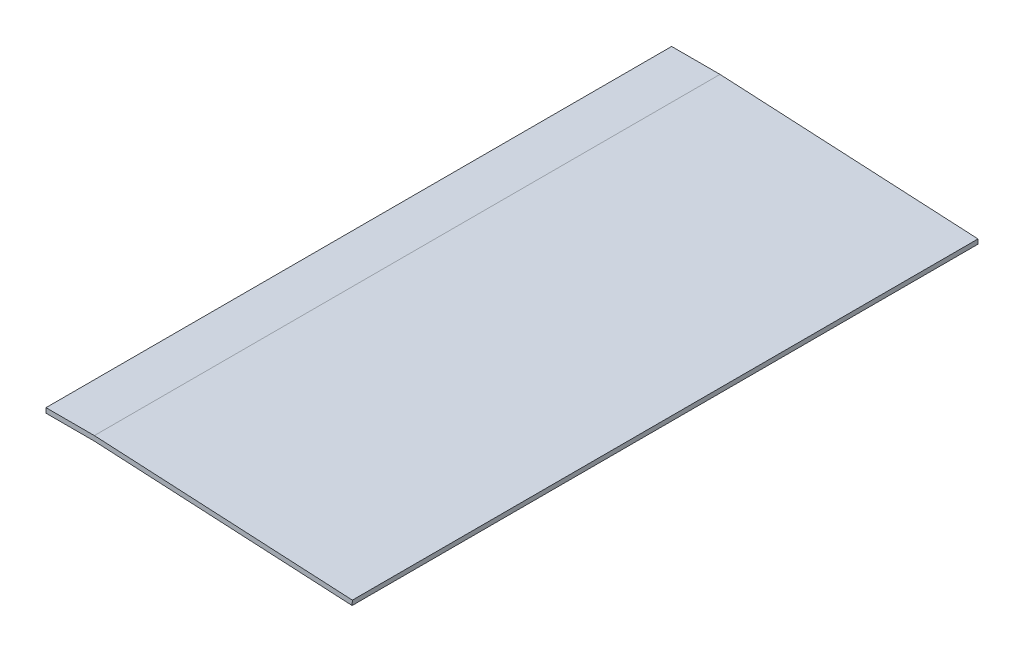
ISO-10303-21;
HEADER;
FILE_DESCRIPTION(('STEP AP214'),'2;1');
FILE_NAME('part.step','',(''),(''),'','','');
FILE_SCHEMA(('AUTOMOTIVE_DESIGN { 1 0 10303 214 1 1 1 1 }'));
ENDSEC;
DATA;
#1=APPLICATION_CONTEXT('core data for automotive mechanical design processes');
#2=APPLICATION_PROTOCOL_DEFINITION('international standard','automotive_design',2000,#1);
#3=PRODUCT_CONTEXT('',#1,'mechanical');
#4=PRODUCT('Part','Part','',(#3));
#5=PRODUCT_RELATED_PRODUCT_CATEGORY('part','',(#4));
#6=PRODUCT_DEFINITION_FORMATION('','',#4);
#7=PRODUCT_DEFINITION_CONTEXT('part definition',#1,'design');
#8=PRODUCT_DEFINITION('design','',#6,#7);
#9=PRODUCT_DEFINITION_SHAPE('','',#8);
#10=(LENGTH_UNIT() NAMED_UNIT(*) SI_UNIT(.MILLI.,.METRE.));
#11=(NAMED_UNIT(*) PLANE_ANGLE_UNIT() SI_UNIT($,.RADIAN.));
#12=(NAMED_UNIT(*) SI_UNIT($,.STERADIAN.) SOLID_ANGLE_UNIT());
#13=UNCERTAINTY_MEASURE_WITH_UNIT(LENGTH_MEASURE(1.E-05),#10,'distance_accuracy_value','');
#14=(GEOMETRIC_REPRESENTATION_CONTEXT(3) GLOBAL_UNCERTAINTY_ASSIGNED_CONTEXT((#13)) GLOBAL_UNIT_ASSIGNED_CONTEXT((#10,
#11,#12)) REPRESENTATION_CONTEXT('',''));
#15=CARTESIAN_POINT('',(0.,0.,0.));
#16=DIRECTION('',(0.,0.,1.));
#17=DIRECTION('',(1.,0.,0.));
#18=AXIS2_PLACEMENT_3D('',#15,#16,#17);
#19=CARTESIAN_POINT('',(0.,0.,388.));
#20=DIRECTION('',(0.,-1.,0.));
#21=DIRECTION('',(1.,0.,0.));
#22=AXIS2_PLACEMENT_3D('',#19,#20,#21);
#23=PLANE('',#22);
#24=DIRECTION('',(-1.,0.,0.));
#25=VECTOR('',#24,1.);
#26=CARTESIAN_POINT('',(0.,0.,0.));
#27=LINE('',#26,#25);
#28=CARTESIAN_POINT('',(30.,0.,0.));
#29=VERTEX_POINT('',#28);
#30=CARTESIAN_POINT('',(0.,0.,0.));
#31=VERTEX_POINT('',#30);
#32=EDGE_CURVE('E121',#29,#31,#27,.T.);
#33=ORIENTED_EDGE('',*,*,#32,.F.);
#34=DIRECTION('',(0.,0.,-1.));
#35=VECTOR('',#34,1.);
#36=CARTESIAN_POINT('',(30.,0.,388.));
#37=LINE('',#36,#35);
#38=CARTESIAN_POINT('',(30.,0.,388.));
#39=VERTEX_POINT('',#38);
#40=EDGE_CURVE('E11',#39,#29,#37,.T.);
#41=ORIENTED_EDGE('',*,*,#40,.F.);
#42=DIRECTION('',(-1.,0.,0.));
#43=VECTOR('',#42,1.);
#44=CARTESIAN_POINT('',(0.,0.,388.));
#45=LINE('',#44,#43);
#46=CARTESIAN_POINT('',(0.,0.,388.));
#47=VERTEX_POINT('',#46);
#48=EDGE_CURVE('E133',#39,#47,#45,.T.);
#49=ORIENTED_EDGE('',*,*,#48,.T.);
#50=DIRECTION('',(0.,0.,-1.));
#51=VECTOR('',#50,1.);
#52=CARTESIAN_POINT('',(0.,0.,388.));
#53=LINE('',#52,#51);
#54=EDGE_CURVE('E55',#47,#31,#53,.T.);
#55=ORIENTED_EDGE('',*,*,#54,.T.);
#56=EDGE_LOOP('',(#33,#41,#49,#55));
#57=FACE_BOUND('',#56,.T.);
#58=ADVANCED_FACE('F39',(#57),#23,.T.);
#59=CARTESIAN_POINT('',(0.0821715694758779,1.56792694901459,388.));
#60=DIRECTION('',(0.0523359562429368,0.998629534754574,0.));
#61=DIRECTION('',(-0.998629534754574,0.0523359562429368,0.));
#62=AXIS2_PLACEMENT_3D('',#59,#60,#61);
#63=PLANE('',#62);
#64=DIRECTION('',(0.998629534754574,-0.0523359562429368,0.));
#65=VECTOR('',#64,1.);
#66=CARTESIAN_POINT('',(0.0821715694758779,1.56792694901459,0.));
#67=LINE('',#66,#65);
#68=CARTESIAN_POINT('',(189.842992131271,-8.37701625155542,0.));
#69=VERTEX_POINT('',#68);
#70=EDGE_CURVE('E123',#29,#69,#67,.T.);
#71=ORIENTED_EDGE('',*,*,#70,.T.);
#72=DIRECTION('',(0.,0.,-1.));
#73=VECTOR('',#72,1.);
#74=CARTESIAN_POINT('',(189.842992131271,-8.37701625155542,388.));
#75=LINE('',#74,#73);
#76=CARTESIAN_POINT('',(189.842992131271,-8.37701625155542,388.));
#77=VERTEX_POINT('',#76);
#78=EDGE_CURVE('E47',#77,#69,#75,.T.);
#79=ORIENTED_EDGE('',*,*,#78,.F.);
#80=DIRECTION('',(0.998629534754574,-0.0523359562429368,0.));
#81=VECTOR('',#80,1.);
#82=CARTESIAN_POINT('',(0.0821715694758779,1.56792694901459,388.));
#83=LINE('',#82,#81);
#84=EDGE_CURVE('E231',#39,#77,#83,.T.);
#85=ORIENTED_EDGE('',*,*,#84,.F.);
#86=ORIENTED_EDGE('',*,*,#40,.T.);
#87=EDGE_LOOP('',(#71,#79,#85,#86));
#88=FACE_BOUND('',#87,.T.);
#89=ADVANCED_FACE('F156',(#88),#63,.F.);
#90=CARTESIAN_POINT('',(189.760820561795,-9.94494320057098,388.));
#91=DIRECTION('',(-0.998629534754574,0.0523359562429419,0.));
#92=DIRECTION('',(-0.0523359562429419,-0.998629534754574,0.));
#93=AXIS2_PLACEMENT_3D('',#90,#91,#92);
#94=PLANE('',#93);
#95=DIRECTION('',(0.0523359562429419,0.998629534754574,0.));
#96=VECTOR('',#95,1.);
#97=CARTESIAN_POINT('',(189.760820561795,-9.94494320057098,0.));
#98=LINE('',#97,#96);
#99=CARTESIAN_POINT('',(190.,-5.3811276472917,0.));
#100=VERTEX_POINT('',#99);
#101=EDGE_CURVE('E125',#69,#100,#98,.T.);
#102=ORIENTED_EDGE('',*,*,#101,.T.);
#103=DIRECTION('',(0.,0.,-1.));
#104=VECTOR('',#103,1.);
#105=CARTESIAN_POINT('',(190.,-5.3811276472917,388.));
#106=LINE('',#105,#104);
#107=CARTESIAN_POINT('',(190.,-5.3811276472917,388.));
#108=VERTEX_POINT('',#107);
#109=EDGE_CURVE('E113',#108,#100,#106,.T.);
#110=ORIENTED_EDGE('',*,*,#109,.F.);
#111=DIRECTION('',(0.0523359562429419,0.998629534754574,0.));
#112=VECTOR('',#111,1.);
#113=CARTESIAN_POINT('',(189.760820561795,-9.94494320057098,388.));
#114=LINE('',#113,#112);
#115=EDGE_CURVE('E101',#77,#108,#114,.T.);
#116=ORIENTED_EDGE('',*,*,#115,.F.);
#117=ORIENTED_EDGE('',*,*,#78,.T.);
#118=EDGE_LOOP('',(#102,#110,#116,#117));
#119=FACE_BOUND('',#118,.T.);
#120=ADVANCED_FACE('F140',(#119),#94,.F.);
#121=CARTESIAN_POINT('',(0.238807253133945,4.5589522209196,388.));
#122=DIRECTION('',(-0.0523103303511996,-0.998630877420956,0.));
#123=DIRECTION('',(0.998630877420956,-0.0523103303511996,0.));
#124=AXIS2_PLACEMENT_3D('',#121,#122,#123);
#125=PLANE('',#124);
#126=DIRECTION('',(-0.998630877420956,0.0523103303511996,0.));
#127=VECTOR('',#126,1.);
#128=CARTESIAN_POINT('',(0.238807253133945,4.5589522209196,0.));
#129=LINE('',#128,#127);
#130=CARTESIAN_POINT('',(30.,3.,0.));
#131=VERTEX_POINT('',#130);
#132=EDGE_CURVE('E110',#100,#131,#129,.T.);
#133=ORIENTED_EDGE('',*,*,#132,.T.);
#134=DIRECTION('',(0.,0.,-1.));
#135=VECTOR('',#134,1.);
#136=CARTESIAN_POINT('',(30.,3.,388.));
#137=LINE('',#136,#135);
#138=CARTESIAN_POINT('',(30.,3.,388.));
#139=VERTEX_POINT('',#138);
#140=EDGE_CURVE('E107',#139,#131,#137,.T.);
#141=ORIENTED_EDGE('',*,*,#140,.F.);
#142=DIRECTION('',(-0.998630877420956,0.0523103303511996,0.));
#143=VECTOR('',#142,1.);
#144=CARTESIAN_POINT('',(0.238807253133945,4.5589522209196,388.));
#145=LINE('',#144,#143);
#146=EDGE_CURVE('E93',#108,#139,#145,.T.);
#147=ORIENTED_EDGE('',*,*,#146,.F.);
#148=ORIENTED_EDGE('',*,*,#109,.T.);
#149=EDGE_LOOP('',(#133,#141,#147,#148));
#150=FACE_BOUND('',#149,.T.);
#151=ADVANCED_FACE('F108',(#150),#125,.F.);
#152=CARTESIAN_POINT('',(0.,3.,388.));
#153=DIRECTION('',(0.,1.,0.));
#154=DIRECTION('',(0.,0.,1.));
#155=AXIS2_PLACEMENT_3D('',#152,#153,#154);
#156=PLANE('',#155);
#157=DIRECTION('',(1.,0.,0.));
#158=VECTOR('',#157,1.);
#159=CARTESIAN_POINT('',(0.,3.,0.));
#160=LINE('',#159,#158);
#161=CARTESIAN_POINT('',(0.,3.,0.));
#162=VERTEX_POINT('',#161);
#163=EDGE_CURVE('E128',#162,#131,#160,.T.);
#164=ORIENTED_EDGE('',*,*,#163,.F.);
#165=DIRECTION('',(0.,0.,-1.));
#166=VECTOR('',#165,1.);
#167=CARTESIAN_POINT('',(0.,3.,388.));
#168=LINE('',#167,#166);
#169=CARTESIAN_POINT('',(0.,3.,388.));
#170=VERTEX_POINT('',#169);
#171=EDGE_CURVE('E74',#170,#162,#168,.T.);
#172=ORIENTED_EDGE('',*,*,#171,.F.);
#173=DIRECTION('',(1.,0.,0.));
#174=VECTOR('',#173,1.);
#175=CARTESIAN_POINT('',(0.,3.,388.));
#176=LINE('',#175,#174);
#177=EDGE_CURVE('E99',#170,#139,#176,.T.);
#178=ORIENTED_EDGE('',*,*,#177,.T.);
#179=ORIENTED_EDGE('',*,*,#140,.T.);
#180=EDGE_LOOP('',(#164,#172,#178,#179));
#181=FACE_BOUND('',#180,.T.);
#182=ADVANCED_FACE('F115',(#181),#156,.T.);
#183=CARTESIAN_POINT('',(0.,0.,388.));
#184=DIRECTION('',(-1.,0.,0.));
#185=DIRECTION('',(0.,0.,1.));
#186=AXIS2_PLACEMENT_3D('',#183,#184,#185);
#187=PLANE('',#186);
#188=DIRECTION('',(0.,1.,0.));
#189=VECTOR('',#188,1.);
#190=CARTESIAN_POINT('',(0.,0.,0.));
#191=LINE('',#190,#189);
#192=EDGE_CURVE('E130',#31,#162,#191,.T.);
#193=ORIENTED_EDGE('',*,*,#192,.F.);
#194=ORIENTED_EDGE('',*,*,#54,.F.);
#195=DIRECTION('',(0.,1.,0.));
#196=VECTOR('',#195,1.);
#197=CARTESIAN_POINT('',(0.,0.,388.));
#198=LINE('',#197,#196);
#199=EDGE_CURVE('E116',#47,#170,#198,.T.);
#200=ORIENTED_EDGE('',*,*,#199,.T.);
#201=ORIENTED_EDGE('',*,*,#171,.T.);
#202=EDGE_LOOP('',(#193,#194,#200,#201));
#203=FACE_BOUND('',#202,.T.);
#204=ADVANCED_FACE('F145',(#203),#187,.T.);
#205=CARTESIAN_POINT('',(0.,0.,388.));
#206=DIRECTION('',(0.,0.,1.));
#207=DIRECTION('',(1.,0.,0.));
#208=AXIS2_PLACEMENT_3D('',#205,#206,#207);
#209=PLANE('',#208);
#210=ORIENTED_EDGE('',*,*,#48,.F.);
#211=ORIENTED_EDGE('',*,*,#84,.T.);
#212=ORIENTED_EDGE('',*,*,#115,.T.);
#213=ORIENTED_EDGE('',*,*,#146,.T.);
#214=ORIENTED_EDGE('',*,*,#177,.F.);
#215=ORIENTED_EDGE('',*,*,#199,.F.);
#216=EDGE_LOOP('',(#210,#211,#212,#213,#214,#215));
#217=FACE_BOUND('',#216,.T.);
#218=ADVANCED_FACE('F96',(#217),#209,.T.);
#219=CARTESIAN_POINT('',(0.,0.,0.));
#220=DIRECTION('',(0.,0.,1.));
#221=DIRECTION('',(1.,0.,0.));
#222=AXIS2_PLACEMENT_3D('',#219,#220,#221);
#223=PLANE('',#222);
#224=ORIENTED_EDGE('',*,*,#32,.T.);
#225=ORIENTED_EDGE('',*,*,#192,.T.);
#226=ORIENTED_EDGE('',*,*,#163,.T.);
#227=ORIENTED_EDGE('',*,*,#132,.F.);
#228=ORIENTED_EDGE('',*,*,#101,.F.);
#229=ORIENTED_EDGE('',*,*,#70,.F.);
#230=EDGE_LOOP('',(#224,#225,#226,#227,#228,#229));
#231=FACE_BOUND('',#230,.T.);
#232=ADVANCED_FACE('F144',(#231),#223,.F.);
#233=CLOSED_SHELL('',(#58,#89,#120,#151,#182,#204,#218,#232));
#234=MANIFOLD_SOLID_BREP('B2',#233);
#235=ADVANCED_BREP_SHAPE_REPRESENTATION('',(#18,#234),#14);
#236=SHAPE_DEFINITION_REPRESENTATION(#9,#235);
ENDSEC;
END-ISO-10303-21;
